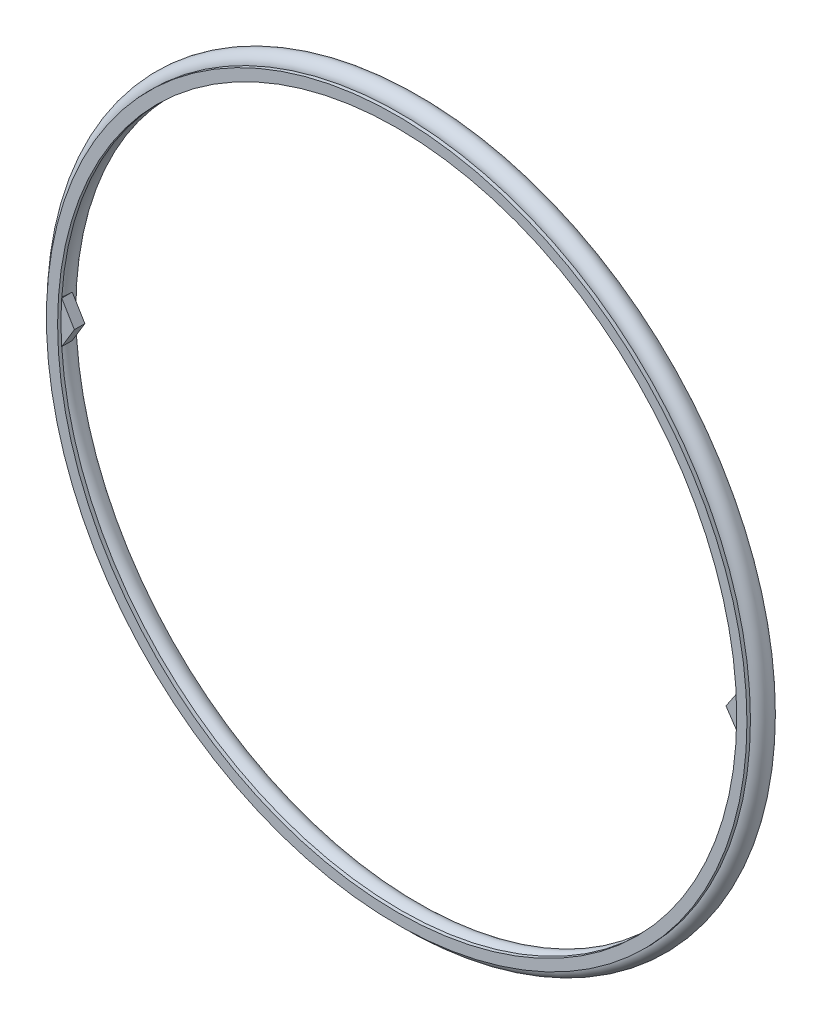
ISO-10303-21;
HEADER;
FILE_DESCRIPTION(('STEP AP214'),'2;1');
FILE_NAME('part.step','',(''),(''),'','','');
FILE_SCHEMA(('AUTOMOTIVE_DESIGN { 1 0 10303 214 1 1 1 1 }'));
ENDSEC;
DATA;
#1=APPLICATION_CONTEXT('core data for automotive mechanical design processes');
#2=APPLICATION_PROTOCOL_DEFINITION('international standard','automotive_design',2000,#1);
#3=PRODUCT_CONTEXT('',#1,'mechanical');
#4=PRODUCT('Part','Part','',(#3));
#5=PRODUCT_RELATED_PRODUCT_CATEGORY('part','',(#4));
#6=PRODUCT_DEFINITION_FORMATION('','',#4);
#7=PRODUCT_DEFINITION_CONTEXT('part definition',#1,'design');
#8=PRODUCT_DEFINITION('design','',#6,#7);
#9=PRODUCT_DEFINITION_SHAPE('','',#8);
#10=(LENGTH_UNIT() NAMED_UNIT(*) SI_UNIT(.MILLI.,.METRE.));
#11=(NAMED_UNIT(*) PLANE_ANGLE_UNIT() SI_UNIT($,.RADIAN.));
#12=(NAMED_UNIT(*) SI_UNIT($,.STERADIAN.) SOLID_ANGLE_UNIT());
#13=UNCERTAINTY_MEASURE_WITH_UNIT(LENGTH_MEASURE(1.E-05),#10,'distance_accuracy_value','');
#14=(GEOMETRIC_REPRESENTATION_CONTEXT(3) GLOBAL_UNCERTAINTY_ASSIGNED_CONTEXT((#13)) GLOBAL_UNIT_ASSIGNED_CONTEXT((#10,
#11,#12)) REPRESENTATION_CONTEXT('',''));
#15=CARTESIAN_POINT('',(0.,0.,0.));
#16=DIRECTION('',(0.,0.,1.));
#17=DIRECTION('',(1.,0.,0.));
#18=AXIS2_PLACEMENT_3D('',#15,#16,#17);
#19=CARTESIAN_POINT('',(-100.088019972676,0.,3.));
#20=DIRECTION('',(0.,0.,1.));
#21=DIRECTION('',(1.,0.,0.));
#22=AXIS2_PLACEMENT_3D('',#19,#20,#21);
#23=PLANE('',#22);
#24=CARTESIAN_POINT('',(-7.,0.,3.));
#25=DIRECTION('',(0.,0.,1.));
#26=DIRECTION('',(1.,0.,0.));
#27=AXIS2_PLACEMENT_3D('',#24,#25,#26);
#28=CIRCLE('',#27,7.00000000000001);
#29=CARTESIAN_POINT('',(-3.09508341671239,5.8096150025251,3.));
#30=VERTEX_POINT('',#29);
#31=CARTESIAN_POINT('',(0.,0.,3.));
#32=VERTEX_POINT('',#31);
#33=EDGE_CURVE('E12',#30,#32,#28,.F.);
#34=ORIENTED_EDGE('',*,*,#33,.F.);
#35=CARTESIAN_POINT('',(-99.949,0.,3.));
#36=DIRECTION('',(0.,0.,-1.));
#37=DIRECTION('',(1.,0.,0.));
#38=AXIS2_PLACEMENT_3D('',#35,#36,#37);
#39=CIRCLE('',#38,97.028);
#40=CARTESIAN_POINT('',(-196.791685188529,5.99392271183861,3.));
#41=VERTEX_POINT('',#40);
#42=EDGE_CURVE('E128',#41,#30,#39,.T.);
#43=ORIENTED_EDGE('',*,*,#42,.F.);
#44=CARTESIAN_POINT('',(-193.176039945352,0.,3.));
#45=DIRECTION('',(0.,0.,1.));
#46=DIRECTION('',(-1.,0.,0.));
#47=AXIS2_PLACEMENT_3D('',#44,#45,#46);
#48=CIRCLE('',#47,7.00000000000002);
#49=CARTESIAN_POINT('',(-200.176039945352,0.,3.));
#50=VERTEX_POINT('',#49);
#51=EDGE_CURVE('E158',#41,#50,#48,.T.);
#52=ORIENTED_EDGE('',*,*,#51,.T.);
#53=CARTESIAN_POINT('',(-100.088019972676,0.,3.));
#54=DIRECTION('',(0.,0.,1.));
#55=DIRECTION('',(-1.,0.,0.));
#56=AXIS2_PLACEMENT_3D('',#53,#54,#55);
#57=CIRCLE('',#56,100.088019972676);
#58=EDGE_CURVE('E68',#32,#50,#57,.T.);
#59=ORIENTED_EDGE('',*,*,#58,.F.);
#60=EDGE_LOOP('',(#34,#43,#52,#59));
#61=FACE_BOUND('',#60,.T.);
#62=ADVANCED_FACE('F47',(#61),#23,.F.);
#63=CARTESIAN_POINT('',(-196.791685188529,-5.99392271183864,3.));
#64=VERTEX_POINT('',#63);
#65=EDGE_CURVE('E133',#50,#64,#48,.T.);
#66=ORIENTED_EDGE('',*,*,#65,.T.);
#67=CARTESIAN_POINT('',(-3.09508341671239,-5.80961500252512,3.));
#68=VERTEX_POINT('',#67);
#69=EDGE_CURVE('E125',#68,#64,#39,.T.);
#70=ORIENTED_EDGE('',*,*,#69,.F.);
#71=CARTESIAN_POINT('',(-7.,0.,3.));
#72=DIRECTION('',(0.,0.,1.));
#73=DIRECTION('',(-1.,0.,0.));
#74=AXIS2_PLACEMENT_3D('',#71,#72,#73);
#75=CIRCLE('',#74,7.00000000000001);
#76=EDGE_CURVE('E62',#68,#32,#75,.T.);
#77=ORIENTED_EDGE('',*,*,#76,.T.);
#78=EDGE_CURVE('E156',#50,#32,#57,.T.);
#79=ORIENTED_EDGE('',*,*,#78,.F.);
#80=EDGE_LOOP('',(#66,#70,#77,#79));
#81=FACE_BOUND('',#80,.T.);
#82=ADVANCED_FACE('F132',(#81),#23,.F.);
#83=CARTESIAN_POINT('',(-193.176039945352,0.,3.));
#84=DIRECTION('',(0.,0.,-1.));
#85=DIRECTION('',(-1.,0.,0.));
#86=AXIS2_PLACEMENT_3D('',#83,#84,#85);
#87=CYLINDRICAL_SURFACE('',#86,7.00000000000002);
#88=CARTESIAN_POINT('',(-193.176039945352,0.,0.));
#89=DIRECTION('',(0.,0.,1.));
#90=DIRECTION('',(-1.,0.,0.));
#91=AXIS2_PLACEMENT_3D('',#88,#89,#90);
#92=CIRCLE('',#91,7.00000000000002);
#93=CARTESIAN_POINT('',(-196.791685188529,5.99392271183868,0.));
#94=VERTEX_POINT('',#93);
#95=CARTESIAN_POINT('',(-196.791685188529,-5.99392271183868,0.));
#96=VERTEX_POINT('',#95);
#97=EDGE_CURVE('E155',#94,#96,#92,.T.);
#98=ORIENTED_EDGE('',*,*,#97,.T.);
#99=DIRECTION('',(0.,0.,-1.));
#100=VECTOR('',#99,1.);
#101=CARTESIAN_POINT('',(-196.791685188529,-5.99392271183868,3.));
#102=LINE('',#101,#100);
#103=EDGE_CURVE('E55',#64,#96,#102,.T.);
#104=ORIENTED_EDGE('',*,*,#103,.F.);
#105=ORIENTED_EDGE('',*,*,#65,.F.);
#106=ORIENTED_EDGE('',*,*,#51,.F.);
#107=DIRECTION('',(0.,0.,-1.));
#108=VECTOR('',#107,1.);
#109=CARTESIAN_POINT('',(-196.791685188529,5.99392271183868,3.));
#110=LINE('',#109,#108);
#111=EDGE_CURVE('E165',#41,#94,#110,.T.);
#112=ORIENTED_EDGE('',*,*,#111,.T.);
#113=EDGE_LOOP('',(#98,#104,#105,#106,#112));
#114=FACE_BOUND('',#113,.T.);
#115=ADVANCED_FACE('F49',(#114),#87,.T.);
#116=CARTESIAN_POINT('',(-193.176039945352,0.,3.));
#117=DIRECTION('',(-0.856274673119809,0.51652074902521,0.));
#118=DIRECTION('',(-0.51652074902521,-0.856274673119809,0.));
#119=AXIS2_PLACEMENT_3D('',#116,#117,#118);
#120=PLANE('',#119);
#121=DIRECTION('',(0.51652074902521,0.856274673119809,0.));
#122=VECTOR('',#121,1.);
#123=CARTESIAN_POINT('',(-193.176039945352,0.,0.));
#124=LINE('',#123,#122);
#125=CARTESIAN_POINT('',(-193.176039945352,0.,0.));
#126=VERTEX_POINT('',#125);
#127=EDGE_CURVE('E168',#96,#126,#124,.T.);
#128=ORIENTED_EDGE('',*,*,#127,.T.);
#129=DIRECTION('',(0.,0.,-1.));
#130=VECTOR('',#129,1.);
#131=CARTESIAN_POINT('',(-193.176039945352,0.,3.));
#132=LINE('',#131,#130);
#133=CARTESIAN_POINT('',(-193.176039945352,0.,3.));
#134=VERTEX_POINT('',#133);
#135=EDGE_CURVE('E174',#134,#126,#132,.T.);
#136=ORIENTED_EDGE('',*,*,#135,.F.);
#137=DIRECTION('',(0.51652074902521,0.856274673119809,0.));
#138=VECTOR('',#137,1.);
#139=CARTESIAN_POINT('',(-193.176039945352,0.,3.));
#140=LINE('',#139,#138);
#141=EDGE_CURVE('E161',#64,#134,#140,.T.);
#142=ORIENTED_EDGE('',*,*,#141,.F.);
#143=ORIENTED_EDGE('',*,*,#103,.T.);
#144=EDGE_LOOP('',(#128,#136,#142,#143));
#145=FACE_BOUND('',#144,.T.);
#146=ADVANCED_FACE('F179',(#145),#120,.F.);
#147=CARTESIAN_POINT('',(-196.791685188529,5.99392271183868,3.));
#148=DIRECTION('',(-0.856274673119809,-0.51652074902521,0.));
#149=DIRECTION('',(0.51652074902521,-0.856274673119809,0.));
#150=AXIS2_PLACEMENT_3D('',#147,#148,#149);
#151=PLANE('',#150);
#152=DIRECTION('',(-0.51652074902521,0.856274673119809,0.));
#153=VECTOR('',#152,1.);
#154=CARTESIAN_POINT('',(-196.791685188529,5.99392271183868,0.));
#155=LINE('',#154,#153);
#156=EDGE_CURVE('E170',#126,#94,#155,.T.);
#157=ORIENTED_EDGE('',*,*,#156,.T.);
#158=ORIENTED_EDGE('',*,*,#111,.F.);
#159=DIRECTION('',(-0.51652074902521,0.856274673119809,0.));
#160=VECTOR('',#159,1.);
#161=CARTESIAN_POINT('',(-196.791685188529,5.99392271183868,3.));
#162=LINE('',#161,#160);
#163=EDGE_CURVE('E163',#134,#41,#162,.T.);
#164=ORIENTED_EDGE('',*,*,#163,.F.);
#165=ORIENTED_EDGE('',*,*,#135,.T.);
#166=EDGE_LOOP('',(#157,#158,#164,#165));
#167=FACE_BOUND('',#166,.T.);
#168=ADVANCED_FACE('F189',(#167),#151,.F.);
#169=CARTESIAN_POINT('',(-193.176039945352,0.,0.));
#170=DIRECTION('',(0.,0.,-1.));
#171=DIRECTION('',(-1.,0.,0.));
#172=AXIS2_PLACEMENT_3D('',#169,#170,#171);
#173=PLANE('',#172);
#174=ORIENTED_EDGE('',*,*,#97,.F.);
#175=ORIENTED_EDGE('',*,*,#156,.F.);
#176=ORIENTED_EDGE('',*,*,#127,.F.);
#177=EDGE_LOOP('',(#174,#175,#176));
#178=FACE_BOUND('',#177,.T.);
#179=ADVANCED_FACE('F187',(#178),#173,.T.);
#180=CARTESIAN_POINT('',(-100.088019972676,0.,4.));
#181=DIRECTION('',(0.,0.,-1.));
#182=DIRECTION('',(-1.,0.,0.));
#183=AXIS2_PLACEMENT_3D('',#180,#181,#182);
#184=CYLINDRICAL_SURFACE('',#183,100.088019972676);
#185=ORIENTED_EDGE('',*,*,#78,.T.);
#186=ORIENTED_EDGE('',*,*,#58,.T.);
#187=EDGE_LOOP('',(#185,#186));
#188=FACE_BOUND('',#187,.T.);
#189=CARTESIAN_POINT('',(-100.088019972676,0.,4.));
#190=DIRECTION('',(0.,0.,1.));
#191=DIRECTION('',(1.,0.,0.));
#192=AXIS2_PLACEMENT_3D('',#189,#190,#191);
#193=CIRCLE('',#192,100.088019972676);
#194=CARTESIAN_POINT('',(0.,0.,4.));
#195=VERTEX_POINT('',#194);
#196=EDGE_CURVE('E152',#195,#195,#193,.T.);
#197=ORIENTED_EDGE('',*,*,#196,.F.);
#198=EDGE_LOOP('',(#197));
#199=FACE_BOUND('',#198,.T.);
#200=ADVANCED_FACE('F224',(#188,#199),#184,.T.);
#201=CARTESIAN_POINT('',(-100.088019972676,0.,4.));
#202=DIRECTION('',(0.,0.,1.));
#203=DIRECTION('',(1.,0.,0.));
#204=AXIS2_PLACEMENT_3D('',#201,#202,#203);
#205=PLANE('',#204);
#206=CARTESIAN_POINT('',(-99.949,0.,4.));
#207=DIRECTION('',(0.,0.,-1.));
#208=DIRECTION('',(-1.,0.,0.));
#209=AXIS2_PLACEMENT_3D('',#206,#207,#208);
#210=CIRCLE('',#209,97.028);
#211=CARTESIAN_POINT('',(-196.977,0.,4.));
#212=VERTEX_POINT('',#211);
#213=EDGE_CURVE('E134',#212,#212,#210,.T.);
#214=ORIENTED_EDGE('',*,*,#213,.T.);
#215=EDGE_LOOP('',(#214));
#216=FACE_BOUND('',#215,.T.);
#217=ORIENTED_EDGE('',*,*,#196,.T.);
#218=EDGE_LOOP('',(#217));
#219=FACE_BOUND('',#218,.T.);
#220=ADVANCED_FACE('F213',(#216,#219),#205,.T.);
#221=CARTESIAN_POINT('',(-7.,0.,3.));
#222=DIRECTION('',(0.,0.,-1.));
#223=DIRECTION('',(-1.,0.,0.));
#224=AXIS2_PLACEMENT_3D('',#221,#222,#223);
#225=CYLINDRICAL_SURFACE('',#224,7.00000000000001);
#226=CARTESIAN_POINT('',(-7.,0.,0.));
#227=DIRECTION('',(0.,0.,1.));
#228=DIRECTION('',(-1.,0.,0.));
#229=AXIS2_PLACEMENT_3D('',#226,#227,#228);
#230=CIRCLE('',#229,7.00000000000001);
#231=CARTESIAN_POINT('',(-3.09508341671236,-5.80961500252515,0.));
#232=VERTEX_POINT('',#231);
#233=CARTESIAN_POINT('',(-3.09508341671236,5.80961500252515,0.));
#234=VERTEX_POINT('',#233);
#235=EDGE_CURVE('E201',#232,#234,#230,.T.);
#236=ORIENTED_EDGE('',*,*,#235,.T.);
#237=DIRECTION('',(0.,0.,-1.));
#238=VECTOR('',#237,1.);
#239=CARTESIAN_POINT('',(-3.09508341671236,5.80961500252515,3.));
#240=LINE('',#239,#238);
#241=EDGE_CURVE('E196',#30,#234,#240,.T.);
#242=ORIENTED_EDGE('',*,*,#241,.F.);
#243=ORIENTED_EDGE('',*,*,#33,.T.);
#244=ORIENTED_EDGE('',*,*,#76,.F.);
#245=DIRECTION('',(0.,0.,-1.));
#246=VECTOR('',#245,1.);
#247=CARTESIAN_POINT('',(-3.09508341671236,-5.80961500252515,3.));
#248=LINE('',#247,#246);
#249=EDGE_CURVE('E118',#68,#232,#248,.T.);
#250=ORIENTED_EDGE('',*,*,#249,.T.);
#251=EDGE_LOOP('',(#236,#242,#243,#244,#250));
#252=FACE_BOUND('',#251,.T.);
#253=ADVANCED_FACE('F145',(#252),#225,.T.);
#254=CARTESIAN_POINT('',(-3.09508341671236,5.80961500252515,3.));
#255=DIRECTION('',(0.829945000360735,-0.557845226183948,0.));
#256=DIRECTION('',(0.557845226183948,0.829945000360735,0.));
#257=AXIS2_PLACEMENT_3D('',#254,#255,#256);
#258=PLANE('',#257);
#259=DIRECTION('',(-0.557845226183947,-0.829945000360735,0.));
#260=VECTOR('',#259,1.);
#261=CARTESIAN_POINT('',(-3.09508341671236,5.80961500252515,0.));
#262=LINE('',#261,#260);
#263=CARTESIAN_POINT('',(-7.,0.,0.));
#264=VERTEX_POINT('',#263);
#265=EDGE_CURVE('E148',#234,#264,#262,.T.);
#266=ORIENTED_EDGE('',*,*,#265,.T.);
#267=DIRECTION('',(0.,0.,-1.));
#268=VECTOR('',#267,1.);
#269=CARTESIAN_POINT('',(-7.,0.,3.));
#270=LINE('',#269,#268);
#271=CARTESIAN_POINT('',(-7.,0.,3.));
#272=VERTEX_POINT('',#271);
#273=EDGE_CURVE('E143',#272,#264,#270,.T.);
#274=ORIENTED_EDGE('',*,*,#273,.F.);
#275=DIRECTION('',(-0.557845226183947,-0.829945000360735,0.));
#276=VECTOR('',#275,1.);
#277=CARTESIAN_POINT('',(-3.09508341671236,5.80961500252515,3.));
#278=LINE('',#277,#276);
#279=EDGE_CURVE('E113',#30,#272,#278,.T.);
#280=ORIENTED_EDGE('',*,*,#279,.F.);
#281=ORIENTED_EDGE('',*,*,#241,.T.);
#282=EDGE_LOOP('',(#266,#274,#280,#281));
#283=FACE_BOUND('',#282,.T.);
#284=ADVANCED_FACE('F205',(#283),#258,.F.);
#285=CARTESIAN_POINT('',(-7.,0.,3.));
#286=DIRECTION('',(0.829945000360735,0.557845226183948,0.));
#287=DIRECTION('',(-0.557845226183948,0.829945000360735,0.));
#288=AXIS2_PLACEMENT_3D('',#285,#286,#287);
#289=PLANE('',#288);
#290=DIRECTION('',(0.557845226183948,-0.829945000360735,0.));
#291=VECTOR('',#290,1.);
#292=CARTESIAN_POINT('',(-7.,0.,0.));
#293=LINE('',#292,#291);
#294=EDGE_CURVE('E139',#264,#232,#293,.T.);
#295=ORIENTED_EDGE('',*,*,#294,.T.);
#296=ORIENTED_EDGE('',*,*,#249,.F.);
#297=DIRECTION('',(0.557845226183948,-0.829945000360735,0.));
#298=VECTOR('',#297,1.);
#299=CARTESIAN_POINT('',(-7.,0.,3.));
#300=LINE('',#299,#298);
#301=EDGE_CURVE('E107',#272,#68,#300,.T.);
#302=ORIENTED_EDGE('',*,*,#301,.F.);
#303=ORIENTED_EDGE('',*,*,#273,.T.);
#304=EDGE_LOOP('',(#295,#296,#302,#303));
#305=FACE_BOUND('',#304,.T.);
#306=ADVANCED_FACE('F137',(#305),#289,.F.);
#307=CARTESIAN_POINT('',(-7.,0.,0.));
#308=DIRECTION('',(0.,0.,-1.));
#309=DIRECTION('',(-1.,0.,0.));
#310=AXIS2_PLACEMENT_3D('',#307,#308,#309);
#311=PLANE('',#310);
#312=ORIENTED_EDGE('',*,*,#235,.F.);
#313=ORIENTED_EDGE('',*,*,#294,.F.);
#314=ORIENTED_EDGE('',*,*,#265,.F.);
#315=EDGE_LOOP('',(#312,#313,#314));
#316=FACE_BOUND('',#315,.T.);
#317=ADVANCED_FACE('F203',(#316),#311,.T.);
#318=CARTESIAN_POINT('',(-99.949,0.,3.));
#319=DIRECTION('',(0.,0.,-1.));
#320=DIRECTION('',(-1.,0.,0.));
#321=AXIS2_PLACEMENT_3D('',#318,#319,#320);
#322=PLANE('',#321);
#323=ORIENTED_EDGE('',*,*,#163,.T.);
#324=EDGE_CURVE('E135',#64,#41,#39,.T.);
#325=ORIENTED_EDGE('',*,*,#324,.F.);
#326=ORIENTED_EDGE('',*,*,#141,.T.);
#327=EDGE_LOOP('',(#323,#325,#326));
#328=FACE_BOUND('',#327,.T.);
#329=ADVANCED_FACE('F192',(#328),#322,.F.);
#330=ORIENTED_EDGE('',*,*,#301,.T.);
#331=EDGE_CURVE('E110',#30,#68,#39,.T.);
#332=ORIENTED_EDGE('',*,*,#331,.F.);
#333=ORIENTED_EDGE('',*,*,#279,.T.);
#334=EDGE_LOOP('',(#330,#332,#333));
#335=FACE_BOUND('',#334,.T.);
#336=ADVANCED_FACE('F109',(#335),#322,.F.);
#337=CARTESIAN_POINT('',(-99.949,0.,4.));
#338=DIRECTION('',(0.,0.,-1.));
#339=DIRECTION('',(-1.,0.,0.));
#340=AXIS2_PLACEMENT_3D('',#337,#338,#339);
#341=CYLINDRICAL_SURFACE('',#340,97.028);
#342=ORIENTED_EDGE('',*,*,#69,.T.);
#343=ORIENTED_EDGE('',*,*,#324,.T.);
#344=ORIENTED_EDGE('',*,*,#42,.T.);
#345=ORIENTED_EDGE('',*,*,#331,.T.);
#346=EDGE_LOOP('',(#342,#343,#344,#345));
#347=FACE_BOUND('',#346,.T.);
#348=ORIENTED_EDGE('',*,*,#213,.F.);
#349=EDGE_LOOP('',(#348));
#350=FACE_BOUND('',#349,.T.);
#351=ADVANCED_FACE('F122',(#347,#350),#341,.F.);
#352=CLOSED_SHELL('',(#62,#82,#115,#146,#168,#179,#200,#220,#253,#284,#306,#317,#329,#336,#351));
#353=MANIFOLD_SOLID_BREP('B2',#352);
#354=CARTESIAN_POINT('',(-99.949,0.,0.));
#355=DIRECTION('',(0.,0.,-1.));
#356=DIRECTION('',(-1.,0.,0.));
#357=AXIS2_PLACEMENT_3D('',#354,#355,#356);
#358=TOROIDAL_SURFACE('',#357,99.949,2.921);
#359=CARTESIAN_POINT('',(-202.819,0.,0.));
#360=VERTEX_POINT('',#359);
#361=VERTEX_LOOP('',#360);
#362=FACE_BOUND('',#361,.T.);
#363=ADVANCED_FACE('F368',(#362),#358,.T.);
#364=CLOSED_SHELL('',(#363));
#365=MANIFOLD_SOLID_BREP('B6',#364);
#366=ADVANCED_BREP_SHAPE_REPRESENTATION('',(#18,#353,#365),#14);
#367=SHAPE_DEFINITION_REPRESENTATION(#9,#366);
ENDSEC;
END-ISO-10303-21;
